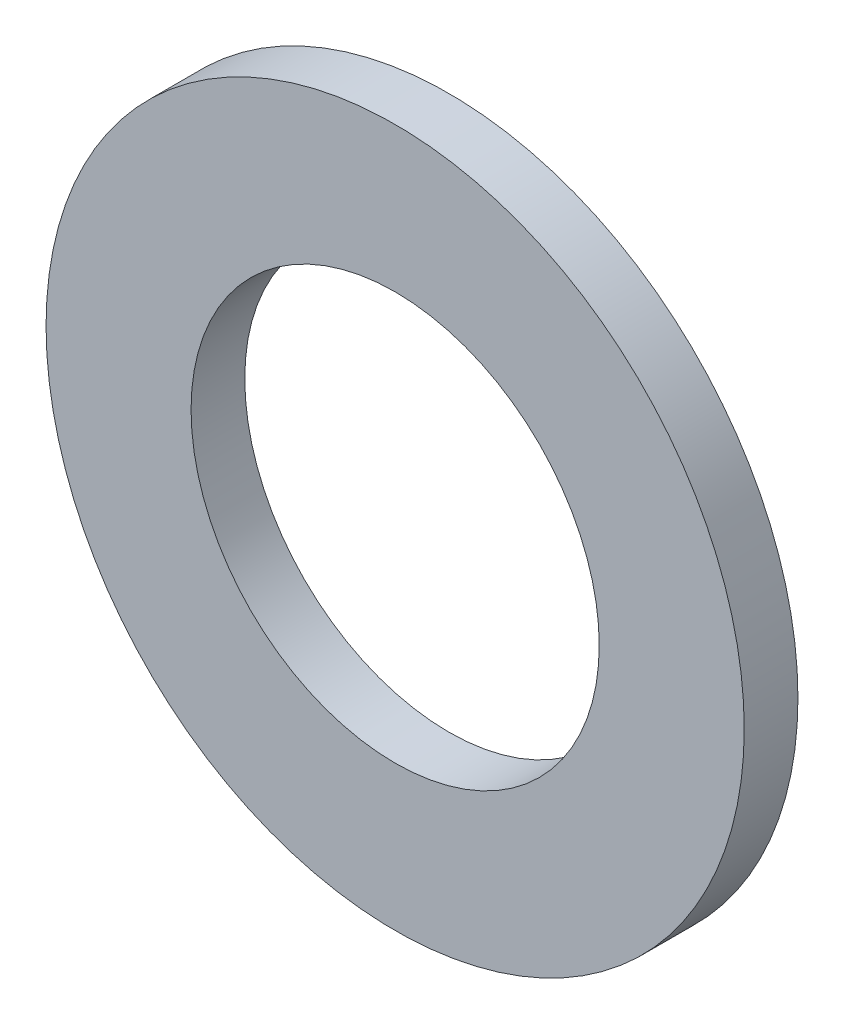
ISO-10303-21;
HEADER;
FILE_DESCRIPTION(('STEP AP214'),'2;1');
FILE_NAME('part.step','',(''),(''),'','','');
FILE_SCHEMA(('AUTOMOTIVE_DESIGN { 1 0 10303 214 1 1 1 1 }'));
ENDSEC;
DATA;
#1=APPLICATION_CONTEXT('core data for automotive mechanical design processes');
#2=APPLICATION_PROTOCOL_DEFINITION('international standard','automotive_design',2000,#1);
#3=PRODUCT_CONTEXT('',#1,'mechanical');
#4=PRODUCT('Part','Part','',(#3));
#5=PRODUCT_RELATED_PRODUCT_CATEGORY('part','',(#4));
#6=PRODUCT_DEFINITION_FORMATION('','',#4);
#7=PRODUCT_DEFINITION_CONTEXT('part definition',#1,'design');
#8=PRODUCT_DEFINITION('design','',#6,#7);
#9=PRODUCT_DEFINITION_SHAPE('','',#8);
#10=(LENGTH_UNIT() NAMED_UNIT(*) SI_UNIT(.MILLI.,.METRE.));
#11=(NAMED_UNIT(*) PLANE_ANGLE_UNIT() SI_UNIT($,.RADIAN.));
#12=(NAMED_UNIT(*) SI_UNIT($,.STERADIAN.) SOLID_ANGLE_UNIT());
#13=UNCERTAINTY_MEASURE_WITH_UNIT(LENGTH_MEASURE(1.E-05),#10,'distance_accuracy_value','');
#14=(GEOMETRIC_REPRESENTATION_CONTEXT(3) GLOBAL_UNCERTAINTY_ASSIGNED_CONTEXT((#13)) GLOBAL_UNIT_ASSIGNED_CONTEXT((#10,
#11,#12)) REPRESENTATION_CONTEXT('',''));
#15=CARTESIAN_POINT('',(0.,0.,0.));
#16=DIRECTION('',(0.,0.,1.));
#17=DIRECTION('',(1.,0.,0.));
#18=AXIS2_PLACEMENT_3D('',#15,#16,#17);
#19=CARTESIAN_POINT('',(0.,0.,5.));
#20=DIRECTION('',(0.,0.,1.));
#21=DIRECTION('',(1.,0.,0.));
#22=AXIS2_PLACEMENT_3D('',#19,#20,#21);
#23=PLANE('',#22);
#24=CARTESIAN_POINT('',(0.,0.,5.));
#25=DIRECTION('',(0.,0.,1.));
#26=DIRECTION('',(1.,0.,0.));
#27=AXIS2_PLACEMENT_3D('',#24,#25,#26);
#28=CIRCLE('',#27,32.5);
#29=CARTESIAN_POINT('',(32.5,0.,5.));
#30=VERTEX_POINT('',#29);
#31=EDGE_CURVE('E10',#30,#30,#28,.T.);
#32=ORIENTED_EDGE('',*,*,#31,.T.);
#33=EDGE_LOOP('',(#32));
#34=FACE_BOUND('',#33,.T.);
#35=CARTESIAN_POINT('',(0.,0.,5.));
#36=DIRECTION('',(0.,0.,1.));
#37=DIRECTION('',(1.,0.,0.));
#38=AXIS2_PLACEMENT_3D('',#35,#36,#37);
#39=CIRCLE('',#38,19.);
#40=CARTESIAN_POINT('',(19.,0.,5.));
#41=VERTEX_POINT('',#40);
#42=EDGE_CURVE('E39',#41,#41,#39,.T.);
#43=ORIENTED_EDGE('',*,*,#42,.F.);
#44=EDGE_LOOP('',(#43));
#45=FACE_BOUND('',#44,.T.);
#46=ADVANCED_FACE('F28',(#34,#45),#23,.T.);
#47=CARTESIAN_POINT('',(0.,0.,0.));
#48=DIRECTION('',(0.,0.,1.));
#49=DIRECTION('',(1.,0.,0.));
#50=AXIS2_PLACEMENT_3D('',#47,#48,#49);
#51=PLANE('',#50);
#52=CARTESIAN_POINT('',(0.,0.,0.));
#53=DIRECTION('',(0.,0.,1.));
#54=DIRECTION('',(1.,0.,0.));
#55=AXIS2_PLACEMENT_3D('',#52,#53,#54);
#56=CIRCLE('',#55,32.5);
#57=CARTESIAN_POINT('',(32.5,0.,0.));
#58=VERTEX_POINT('',#57);
#59=EDGE_CURVE('E32',#58,#58,#56,.T.);
#60=ORIENTED_EDGE('',*,*,#59,.F.);
#61=EDGE_LOOP('',(#60));
#62=FACE_BOUND('',#61,.T.);
#63=CARTESIAN_POINT('',(0.,0.,0.));
#64=DIRECTION('',(0.,0.,1.));
#65=DIRECTION('',(1.,0.,0.));
#66=AXIS2_PLACEMENT_3D('',#63,#64,#65);
#67=CIRCLE('',#66,19.);
#68=CARTESIAN_POINT('',(19.,0.,0.));
#69=VERTEX_POINT('',#68);
#70=EDGE_CURVE('E41',#69,#69,#67,.T.);
#71=ORIENTED_EDGE('',*,*,#70,.T.);
#72=EDGE_LOOP('',(#71));
#73=FACE_BOUND('',#72,.T.);
#74=ADVANCED_FACE('F51',(#62,#73),#51,.F.);
#75=CARTESIAN_POINT('',(0.,0.,5.));
#76=DIRECTION('',(0.,0.,-1.));
#77=DIRECTION('',(-1.,0.,0.));
#78=AXIS2_PLACEMENT_3D('',#75,#76,#77);
#79=CYLINDRICAL_SURFACE('',#78,32.5);
#80=ORIENTED_EDGE('',*,*,#31,.F.);
#81=EDGE_LOOP('',(#80));
#82=FACE_BOUND('',#81,.T.);
#83=ORIENTED_EDGE('',*,*,#59,.T.);
#84=EDGE_LOOP('',(#83));
#85=FACE_BOUND('',#84,.T.);
#86=ADVANCED_FACE('F30',(#82,#85),#79,.T.);
#87=CARTESIAN_POINT('',(0.,0.,5.));
#88=DIRECTION('',(0.,0.,-1.));
#89=DIRECTION('',(-1.,0.,0.));
#90=AXIS2_PLACEMENT_3D('',#87,#88,#89);
#91=CYLINDRICAL_SURFACE('',#90,19.);
#92=ORIENTED_EDGE('',*,*,#42,.T.);
#93=EDGE_LOOP('',(#92));
#94=FACE_BOUND('',#93,.T.);
#95=ORIENTED_EDGE('',*,*,#70,.F.);
#96=EDGE_LOOP('',(#95));
#97=FACE_BOUND('',#96,.T.);
#98=ADVANCED_FACE('F47',(#94,#97),#91,.F.);
#99=CLOSED_SHELL('',(#46,#74,#86,#98));
#100=MANIFOLD_SOLID_BREP('B2',#99);
#101=ADVANCED_BREP_SHAPE_REPRESENTATION('',(#18,#100),#14);
#102=SHAPE_DEFINITION_REPRESENTATION(#9,#101);
ENDSEC;
END-ISO-10303-21;
